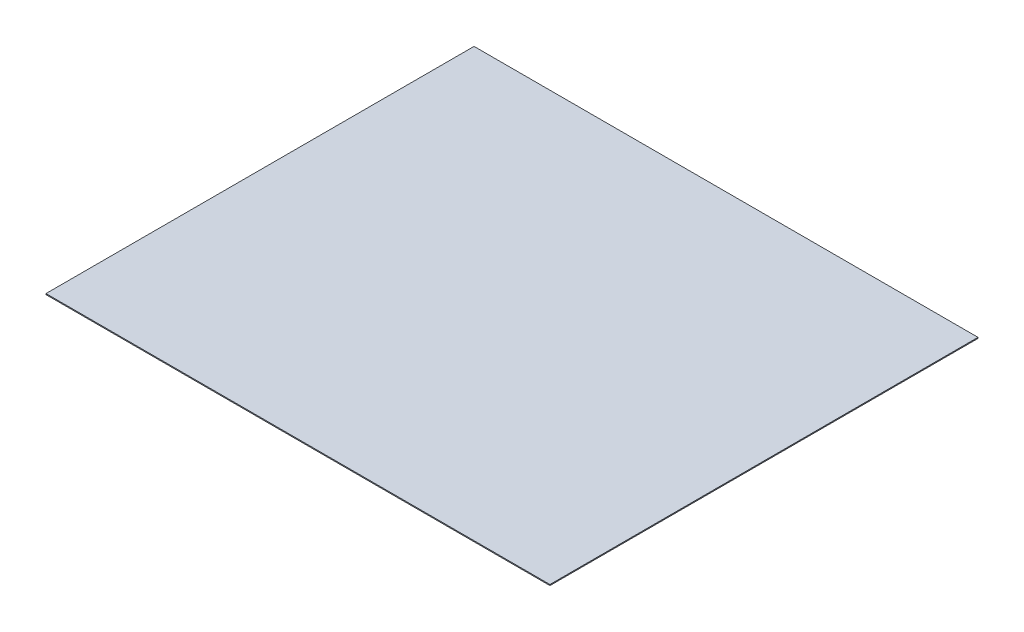
ISO-10303-21;
HEADER;
FILE_DESCRIPTION(('STEP AP214'),'2;1');
FILE_NAME('part.step','',(''),(''),'','','');
FILE_SCHEMA(('AUTOMOTIVE_DESIGN { 1 0 10303 214 1 1 1 1 }'));
ENDSEC;
DATA;
#1=APPLICATION_CONTEXT('core data for automotive mechanical design processes');
#2=APPLICATION_PROTOCOL_DEFINITION('international standard','automotive_design',2000,#1);
#3=PRODUCT_CONTEXT('',#1,'mechanical');
#4=PRODUCT('Part','Part','',(#3));
#5=PRODUCT_RELATED_PRODUCT_CATEGORY('part','',(#4));
#6=PRODUCT_DEFINITION_FORMATION('','',#4);
#7=PRODUCT_DEFINITION_CONTEXT('part definition',#1,'design');
#8=PRODUCT_DEFINITION('design','',#6,#7);
#9=PRODUCT_DEFINITION_SHAPE('','',#8);
#10=(LENGTH_UNIT() NAMED_UNIT(*) SI_UNIT(.MILLI.,.METRE.));
#11=(NAMED_UNIT(*) PLANE_ANGLE_UNIT() SI_UNIT($,.RADIAN.));
#12=(NAMED_UNIT(*) SI_UNIT($,.STERADIAN.) SOLID_ANGLE_UNIT());
#13=UNCERTAINTY_MEASURE_WITH_UNIT(LENGTH_MEASURE(1.E-05),#10,'distance_accuracy_value','');
#14=(GEOMETRIC_REPRESENTATION_CONTEXT(3) GLOBAL_UNCERTAINTY_ASSIGNED_CONTEXT((#13)) GLOBAL_UNIT_ASSIGNED_CONTEXT((#10,
#11,#12)) REPRESENTATION_CONTEXT('',''));
#15=CARTESIAN_POINT('',(0.,0.,0.));
#16=DIRECTION('',(0.,0.,1.));
#17=DIRECTION('',(1.,0.,0.));
#18=AXIS2_PLACEMENT_3D('',#15,#16,#17);
#19=CARTESIAN_POINT('',(0.,2.9,0.));
#20=DIRECTION('',(1.,0.,0.));
#21=DIRECTION('',(0.,0.,-1.));
#22=AXIS2_PLACEMENT_3D('',#19,#20,#21);
#23=PLANE('',#22);
#24=DIRECTION('',(0.,0.,1.));
#25=VECTOR('',#24,1.);
#26=CARTESIAN_POINT('',(0.,0.,0.));
#27=LINE('',#26,#25);
#28=CARTESIAN_POINT('',(0.,0.,0.));
#29=VERTEX_POINT('',#28);
#30=CARTESIAN_POINT('',(1.5408506026872E-13,0.,1258.2));
#31=VERTEX_POINT('',#30);
#32=EDGE_CURVE('E98',#29,#31,#27,.T.);
#33=ORIENTED_EDGE('',*,*,#32,.T.);
#34=DIRECTION('',(0.,-1.,0.));
#35=VECTOR('',#34,1.);
#36=CARTESIAN_POINT('',(1.5408506026872E-13,2.9,1258.2));
#37=LINE('',#36,#35);
#38=CARTESIAN_POINT('',(1.5408506026872E-13,2.9,1258.2));
#39=VERTEX_POINT('',#38);
#40=EDGE_CURVE('E11',#39,#31,#37,.T.);
#41=ORIENTED_EDGE('',*,*,#40,.F.);
#42=DIRECTION('',(0.,0.,1.));
#43=VECTOR('',#42,1.);
#44=CARTESIAN_POINT('',(0.,2.9,0.));
#45=LINE('',#44,#43);
#46=CARTESIAN_POINT('',(0.,2.9,0.));
#47=VERTEX_POINT('',#46);
#48=EDGE_CURVE('E86',#47,#39,#45,.T.);
#49=ORIENTED_EDGE('',*,*,#48,.F.);
#50=DIRECTION('',(0.,-1.,0.));
#51=VECTOR('',#50,1.);
#52=CARTESIAN_POINT('',(0.,2.9,0.));
#53=LINE('',#52,#51);
#54=EDGE_CURVE('E94',#47,#29,#53,.T.);
#55=ORIENTED_EDGE('',*,*,#54,.T.);
#56=EDGE_LOOP('',(#33,#41,#49,#55));
#57=FACE_BOUND('',#56,.T.);
#58=ADVANCED_FACE('F35',(#57),#23,.F.);
#59=CARTESIAN_POINT('',(1.5408506026872E-13,2.9,1258.2));
#60=DIRECTION('',(0.,0.,-1.));
#61=DIRECTION('',(-1.,0.,0.));
#62=AXIS2_PLACEMENT_3D('',#59,#60,#61);
#63=PLANE('',#62);
#64=DIRECTION('',(1.,0.,0.));
#65=VECTOR('',#64,1.);
#66=CARTESIAN_POINT('',(1.5408506026872E-13,0.,1258.2));
#67=LINE('',#66,#65);
#68=CARTESIAN_POINT('',(1481.2,0.,1258.2));
#69=VERTEX_POINT('',#68);
#70=EDGE_CURVE('E90',#31,#69,#67,.T.);
#71=ORIENTED_EDGE('',*,*,#70,.T.);
#72=DIRECTION('',(0.,-1.,0.));
#73=VECTOR('',#72,1.);
#74=CARTESIAN_POINT('',(1481.2,2.9,1258.2));
#75=LINE('',#74,#73);
#76=CARTESIAN_POINT('',(1481.2,2.9,1258.2));
#77=VERTEX_POINT('',#76);
#78=EDGE_CURVE('E43',#77,#69,#75,.T.);
#79=ORIENTED_EDGE('',*,*,#78,.F.);
#80=DIRECTION('',(1.,0.,0.));
#81=VECTOR('',#80,1.);
#82=CARTESIAN_POINT('',(1.5408506026872E-13,2.9,1258.2));
#83=LINE('',#82,#81);
#84=EDGE_CURVE('E81',#39,#77,#83,.T.);
#85=ORIENTED_EDGE('',*,*,#84,.F.);
#86=ORIENTED_EDGE('',*,*,#40,.T.);
#87=EDGE_LOOP('',(#71,#79,#85,#86));
#88=FACE_BOUND('',#87,.T.);
#89=ADVANCED_FACE('F89',(#88),#63,.F.);
#90=CARTESIAN_POINT('',(1481.2,2.9,0.));
#91=DIRECTION('',(-1.,0.,0.));
#92=DIRECTION('',(0.,0.,1.));
#93=AXIS2_PLACEMENT_3D('',#90,#91,#92);
#94=PLANE('',#93);
#95=DIRECTION('',(0.,0.,-1.));
#96=VECTOR('',#95,1.);
#97=CARTESIAN_POINT('',(1481.2,0.,0.));
#98=LINE('',#97,#96);
#99=CARTESIAN_POINT('',(1481.2,0.,0.));
#100=VERTEX_POINT('',#99);
#101=EDGE_CURVE('E68',#69,#100,#98,.T.);
#102=ORIENTED_EDGE('',*,*,#101,.T.);
#103=DIRECTION('',(0.,-1.,0.));
#104=VECTOR('',#103,1.);
#105=CARTESIAN_POINT('',(1481.2,2.9,0.));
#106=LINE('',#105,#104);
#107=CARTESIAN_POINT('',(1481.2,2.9,0.));
#108=VERTEX_POINT('',#107);
#109=EDGE_CURVE('E91',#108,#100,#106,.T.);
#110=ORIENTED_EDGE('',*,*,#109,.F.);
#111=DIRECTION('',(0.,0.,-1.));
#112=VECTOR('',#111,1.);
#113=CARTESIAN_POINT('',(1481.2,2.9,0.));
#114=LINE('',#113,#112);
#115=EDGE_CURVE('E84',#77,#108,#114,.T.);
#116=ORIENTED_EDGE('',*,*,#115,.F.);
#117=ORIENTED_EDGE('',*,*,#78,.T.);
#118=EDGE_LOOP('',(#102,#110,#116,#117));
#119=FACE_BOUND('',#118,.T.);
#120=ADVANCED_FACE('F92',(#119),#94,.F.);
#121=CARTESIAN_POINT('',(0.,2.9,0.));
#122=DIRECTION('',(0.,0.,1.));
#123=DIRECTION('',(1.,0.,0.));
#124=AXIS2_PLACEMENT_3D('',#121,#122,#123);
#125=PLANE('',#124);
#126=DIRECTION('',(-1.,0.,0.));
#127=VECTOR('',#126,1.);
#128=CARTESIAN_POINT('',(0.,0.,0.));
#129=LINE('',#128,#127);
#130=EDGE_CURVE('E74',#100,#29,#129,.T.);
#131=ORIENTED_EDGE('',*,*,#130,.T.);
#132=ORIENTED_EDGE('',*,*,#54,.F.);
#133=DIRECTION('',(-1.,0.,0.));
#134=VECTOR('',#133,1.);
#135=CARTESIAN_POINT('',(0.,2.9,0.));
#136=LINE('',#135,#134);
#137=EDGE_CURVE('E51',#108,#47,#136,.T.);
#138=ORIENTED_EDGE('',*,*,#137,.F.);
#139=ORIENTED_EDGE('',*,*,#109,.T.);
#140=EDGE_LOOP('',(#131,#132,#138,#139));
#141=FACE_BOUND('',#140,.T.);
#142=ADVANCED_FACE('F105',(#141),#125,.F.);
#143=CARTESIAN_POINT('',(0.,2.9,0.));
#144=DIRECTION('',(0.,1.,0.));
#145=DIRECTION('',(0.,0.,1.));
#146=AXIS2_PLACEMENT_3D('',#143,#144,#145);
#147=PLANE('',#146);
#148=ORIENTED_EDGE('',*,*,#48,.T.);
#149=ORIENTED_EDGE('',*,*,#84,.T.);
#150=ORIENTED_EDGE('',*,*,#115,.T.);
#151=ORIENTED_EDGE('',*,*,#137,.T.);
#152=EDGE_LOOP('',(#148,#149,#150,#151));
#153=FACE_BOUND('',#152,.T.);
#154=ADVANCED_FACE('F82',(#153),#147,.T.);
#155=CARTESIAN_POINT('',(0.,0.,0.));
#156=DIRECTION('',(0.,1.,0.));
#157=DIRECTION('',(0.,0.,1.));
#158=AXIS2_PLACEMENT_3D('',#155,#156,#157);
#159=PLANE('',#158);
#160=ORIENTED_EDGE('',*,*,#32,.F.);
#161=ORIENTED_EDGE('',*,*,#130,.F.);
#162=ORIENTED_EDGE('',*,*,#101,.F.);
#163=ORIENTED_EDGE('',*,*,#70,.F.);
#164=EDGE_LOOP('',(#160,#161,#162,#163));
#165=FACE_BOUND('',#164,.T.);
#166=ADVANCED_FACE('F108',(#165),#159,.F.);
#167=CLOSED_SHELL('',(#58,#89,#120,#142,#154,#166));
#168=MANIFOLD_SOLID_BREP('B2',#167);
#169=ADVANCED_BREP_SHAPE_REPRESENTATION('',(#18,#168),#14);
#170=SHAPE_DEFINITION_REPRESENTATION(#9,#169);
ENDSEC;
END-ISO-10303-21;
